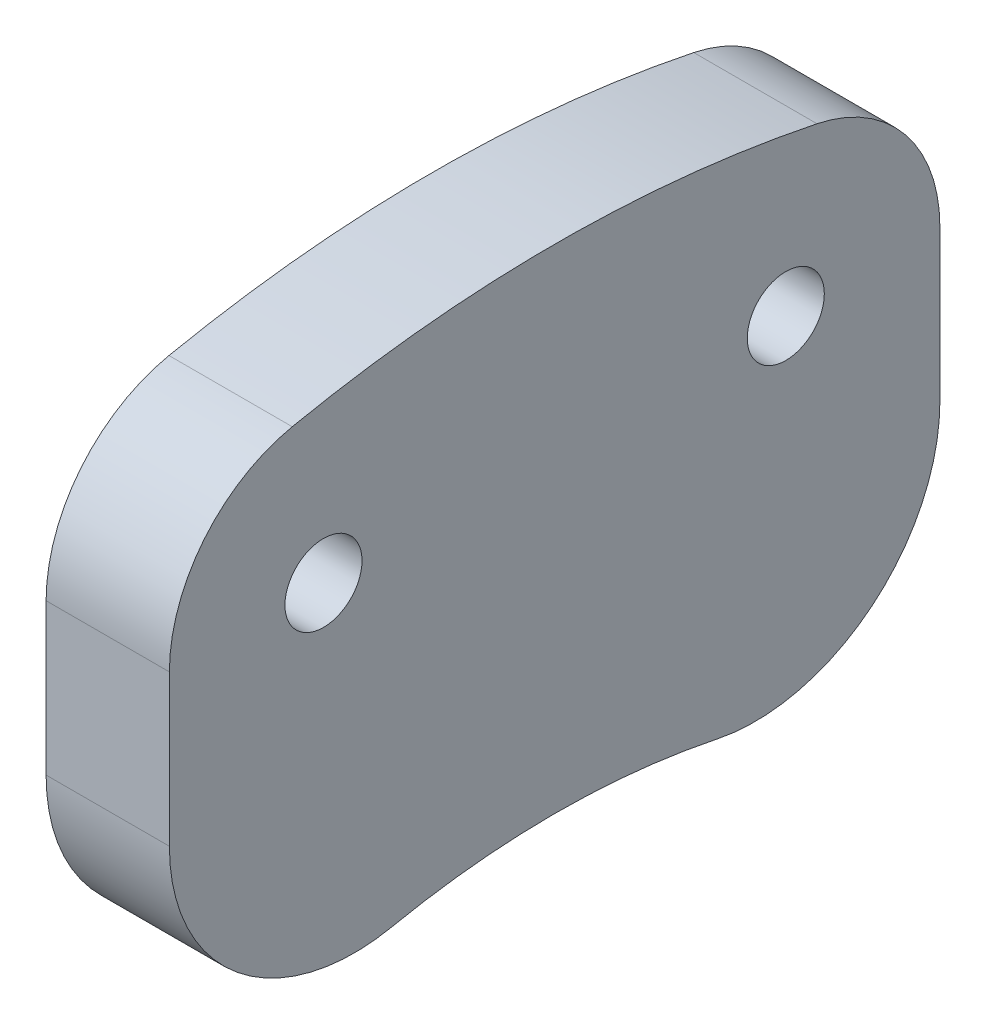
ISO-10303-21;
HEADER;
FILE_DESCRIPTION(('STEP AP214'),'2;1');
FILE_NAME('part.step','',(''),(''),'','','');
FILE_SCHEMA(('AUTOMOTIVE_DESIGN { 1 0 10303 214 1 1 1 1 }'));
ENDSEC;
DATA;
#1=APPLICATION_CONTEXT('core data for automotive mechanical design processes');
#2=APPLICATION_PROTOCOL_DEFINITION('international standard','automotive_design',2000,#1);
#3=PRODUCT_CONTEXT('',#1,'mechanical');
#4=PRODUCT('Part','Part','',(#3));
#5=PRODUCT_RELATED_PRODUCT_CATEGORY('part','',(#4));
#6=PRODUCT_DEFINITION_FORMATION('','',#4);
#7=PRODUCT_DEFINITION_CONTEXT('part definition',#1,'design');
#8=PRODUCT_DEFINITION('design','',#6,#7);
#9=PRODUCT_DEFINITION_SHAPE('','',#8);
#10=(LENGTH_UNIT() NAMED_UNIT(*) SI_UNIT(.MILLI.,.METRE.));
#11=(NAMED_UNIT(*) PLANE_ANGLE_UNIT() SI_UNIT($,.RADIAN.));
#12=(NAMED_UNIT(*) SI_UNIT($,.STERADIAN.) SOLID_ANGLE_UNIT());
#13=UNCERTAINTY_MEASURE_WITH_UNIT(LENGTH_MEASURE(1.E-05),#10,'distance_accuracy_value','');
#14=(GEOMETRIC_REPRESENTATION_CONTEXT(3) GLOBAL_UNCERTAINTY_ASSIGNED_CONTEXT((#13)) GLOBAL_UNIT_ASSIGNED_CONTEXT((#10,
#11,#12)) REPRESENTATION_CONTEXT('',''));
#15=CARTESIAN_POINT('',(0.,0.,0.));
#16=DIRECTION('',(0.,0.,1.));
#17=DIRECTION('',(1.,0.,0.));
#18=AXIS2_PLACEMENT_3D('',#15,#16,#17);
#19=CARTESIAN_POINT('',(4.,0.,-12.5));
#20=DIRECTION('',(0.,0.,-1.));
#21=DIRECTION('',(0.,1.,0.));
#22=AXIS2_PLACEMENT_3D('',#19,#20,#21);
#23=PLANE('',#22);
#24=DIRECTION('',(0.,-1.,0.));
#25=VECTOR('',#24,1.);
#26=CARTESIAN_POINT('',(4.,0.,-12.5));
#27=LINE('',#26,#25);
#28=CARTESIAN_POINT('',(4.,9.80532533004706,-12.5));
#29=VERTEX_POINT('',#28);
#30=CARTESIAN_POINT('',(4.,4.90632336884903,-12.5));
#31=VERTEX_POINT('',#30);
#32=EDGE_CURVE('E113',#29,#31,#27,.T.);
#33=ORIENTED_EDGE('',*,*,#32,.T.);
#34=DIRECTION('',(-1.,0.,0.));
#35=VECTOR('',#34,1.);
#36=CARTESIAN_POINT('',(4.,4.90632336884903,-12.5));
#37=LINE('',#36,#35);
#38=CARTESIAN_POINT('',(0.,4.90632336884903,-12.5));
#39=VERTEX_POINT('',#38);
#40=EDGE_CURVE('E11',#31,#39,#37,.T.);
#41=ORIENTED_EDGE('',*,*,#40,.T.);
#42=DIRECTION('',(0.,-1.,0.));
#43=VECTOR('',#42,1.);
#44=CARTESIAN_POINT('',(0.,0.,-12.5));
#45=LINE('',#44,#43);
#46=CARTESIAN_POINT('',(0.,9.80532533004706,-12.5));
#47=VERTEX_POINT('',#46);
#48=EDGE_CURVE('E116',#47,#39,#45,.T.);
#49=ORIENTED_EDGE('',*,*,#48,.F.);
#50=DIRECTION('',(-1.,0.,0.));
#51=VECTOR('',#50,1.);
#52=CARTESIAN_POINT('',(4.,9.80532533004706,-12.5));
#53=LINE('',#52,#51);
#54=EDGE_CURVE('E111',#29,#47,#53,.T.);
#55=ORIENTED_EDGE('',*,*,#54,.F.);
#56=EDGE_LOOP('',(#33,#41,#49,#55));
#57=FACE_BOUND('',#56,.T.);
#58=ADVANCED_FACE('F43',(#57),#23,.T.);
#59=CARTESIAN_POINT('',(4.,9.80532533004706,-7.5));
#60=DIRECTION('',(-1.,0.,0.));
#61=DIRECTION('',(0.,0.,1.));
#62=AXIS2_PLACEMENT_3D('',#59,#60,#61);
#63=CYLINDRICAL_SURFACE('',#62,5.00000000000001);
#64=CARTESIAN_POINT('',(0.,9.80532533004706,-7.5));
#65=DIRECTION('',(1.,0.,0.));
#66=DIRECTION('',(0.,0.,-1.));
#67=AXIS2_PLACEMENT_3D('',#64,#65,#66);
#68=CIRCLE('',#67,5.00000000000001);
#69=CARTESIAN_POINT('',(0.,14.7015269555855,-8.51351351351352));
#70=VERTEX_POINT('',#69);
#71=EDGE_CURVE('E149',#47,#70,#68,.T.);
#72=ORIENTED_EDGE('',*,*,#71,.T.);
#73=DIRECTION('',(-1.,0.,0.));
#74=VECTOR('',#73,1.);
#75=CARTESIAN_POINT('',(4.,14.7015269555855,-8.51351351351352));
#76=LINE('',#75,#74);
#77=CARTESIAN_POINT('',(4.,14.7015269555855,-8.51351351351352));
#78=VERTEX_POINT('',#77);
#79=EDGE_CURVE('E120',#78,#70,#76,.T.);
#80=ORIENTED_EDGE('',*,*,#79,.F.);
#81=CARTESIAN_POINT('',(4.,9.80532533004706,-7.5));
#82=DIRECTION('',(1.,0.,0.));
#83=DIRECTION('',(0.,0.,-1.));
#84=AXIS2_PLACEMENT_3D('',#81,#82,#83);
#85=CIRCLE('',#84,5.00000000000001);
#86=EDGE_CURVE('E123',#29,#78,#85,.T.);
#87=ORIENTED_EDGE('',*,*,#86,.F.);
#88=ORIENTED_EDGE('',*,*,#54,.T.);
#89=EDGE_LOOP('',(#72,#80,#87,#88));
#90=FACE_BOUND('',#89,.T.);
#91=ADVANCED_FACE('F124',(#90),#63,.T.);
#92=CARTESIAN_POINT('',(4.,-26.4265666989376,0.));
#93=DIRECTION('',(-1.,0.,0.));
#94=DIRECTION('',(0.,0.,1.));
#95=AXIS2_PLACEMENT_3D('',#92,#93,#94);
#96=CYLINDRICAL_SURFACE('',#95,42.);
#97=CARTESIAN_POINT('',(0.,-26.4265666989376,0.));
#98=DIRECTION('',(1.,0.,0.));
#99=DIRECTION('',(0.,0.,-1.));
#100=AXIS2_PLACEMENT_3D('',#97,#98,#99);
#101=CIRCLE('',#100,42.);
#102=CARTESIAN_POINT('',(0.,14.7015269555855,8.51351351351351));
#103=VERTEX_POINT('',#102);
#104=EDGE_CURVE('E151',#70,#103,#101,.T.);
#105=ORIENTED_EDGE('',*,*,#104,.T.);
#106=DIRECTION('',(-1.,0.,0.));
#107=VECTOR('',#106,1.);
#108=CARTESIAN_POINT('',(4.,14.7015269555855,8.51351351351351));
#109=LINE('',#108,#107);
#110=CARTESIAN_POINT('',(4.,14.7015269555855,8.51351351351351));
#111=VERTEX_POINT('',#110);
#112=EDGE_CURVE('E158',#111,#103,#109,.T.);
#113=ORIENTED_EDGE('',*,*,#112,.F.);
#114=CARTESIAN_POINT('',(4.,-26.4265666989376,0.));
#115=DIRECTION('',(1.,0.,0.));
#116=DIRECTION('',(0.,0.,-1.));
#117=AXIS2_PLACEMENT_3D('',#114,#115,#116);
#118=CIRCLE('',#117,42.);
#119=EDGE_CURVE('E127',#78,#111,#118,.T.);
#120=ORIENTED_EDGE('',*,*,#119,.F.);
#121=ORIENTED_EDGE('',*,*,#79,.T.);
#122=EDGE_LOOP('',(#105,#113,#120,#121));
#123=FACE_BOUND('',#122,.T.);
#124=ADVANCED_FACE('F191',(#123),#96,.T.);
#125=CARTESIAN_POINT('',(4.,9.80532533004706,7.5));
#126=DIRECTION('',(-1.,0.,0.));
#127=DIRECTION('',(0.,0.,1.));
#128=AXIS2_PLACEMENT_3D('',#125,#126,#127);
#129=CYLINDRICAL_SURFACE('',#128,5.00000000000001);
#130=CARTESIAN_POINT('',(0.,9.80532533004706,7.5));
#131=DIRECTION('',(1.,0.,0.));
#132=DIRECTION('',(0.,0.,-1.));
#133=AXIS2_PLACEMENT_3D('',#130,#131,#132);
#134=CIRCLE('',#133,5.00000000000001);
#135=CARTESIAN_POINT('',(0.,9.80532533004706,12.5));
#136=VERTEX_POINT('',#135);
#137=EDGE_CURVE('E153',#103,#136,#134,.T.);
#138=ORIENTED_EDGE('',*,*,#137,.T.);
#139=DIRECTION('',(-1.,0.,0.));
#140=VECTOR('',#139,1.);
#141=CARTESIAN_POINT('',(4.,9.80532533004706,12.5));
#142=LINE('',#141,#140);
#143=CARTESIAN_POINT('',(4.,9.80532533004706,12.5));
#144=VERTEX_POINT('',#143);
#145=EDGE_CURVE('E147',#144,#136,#142,.T.);
#146=ORIENTED_EDGE('',*,*,#145,.F.);
#147=CARTESIAN_POINT('',(4.,9.80532533004706,7.5));
#148=DIRECTION('',(1.,0.,0.));
#149=DIRECTION('',(0.,0.,-1.));
#150=AXIS2_PLACEMENT_3D('',#147,#148,#149);
#151=CIRCLE('',#150,5.00000000000001);
#152=EDGE_CURVE('E140',#111,#144,#151,.T.);
#153=ORIENTED_EDGE('',*,*,#152,.F.);
#154=ORIENTED_EDGE('',*,*,#112,.T.);
#155=EDGE_LOOP('',(#138,#146,#153,#154));
#156=FACE_BOUND('',#155,.T.);
#157=ADVANCED_FACE('F187',(#156),#129,.T.);
#158=CARTESIAN_POINT('',(4.,0.,12.5));
#159=DIRECTION('',(0.,0.,-1.));
#160=DIRECTION('',(0.,1.,0.));
#161=AXIS2_PLACEMENT_3D('',#158,#159,#160);
#162=PLANE('',#161);
#163=DIRECTION('',(0.,-1.,0.));
#164=VECTOR('',#163,1.);
#165=CARTESIAN_POINT('',(0.,0.,12.5));
#166=LINE('',#165,#164);
#167=CARTESIAN_POINT('',(0.,4.90632336884903,12.5));
#168=VERTEX_POINT('',#167);
#169=EDGE_CURVE('E133',#136,#168,#166,.T.);
#170=ORIENTED_EDGE('',*,*,#169,.T.);
#171=DIRECTION('',(1.,0.,0.));
#172=VECTOR('',#171,1.);
#173=CARTESIAN_POINT('',(4.,4.90632336884903,12.5));
#174=LINE('',#173,#172);
#175=CARTESIAN_POINT('',(4.,4.90632336884903,12.5));
#176=VERTEX_POINT('',#175);
#177=EDGE_CURVE('E66',#168,#176,#174,.T.);
#178=ORIENTED_EDGE('',*,*,#177,.T.);
#179=DIRECTION('',(0.,-1.,0.));
#180=VECTOR('',#179,1.);
#181=CARTESIAN_POINT('',(4.,0.,12.5));
#182=LINE('',#181,#180);
#183=EDGE_CURVE('E142',#144,#176,#182,.T.);
#184=ORIENTED_EDGE('',*,*,#183,.F.);
#185=ORIENTED_EDGE('',*,*,#145,.T.);
#186=EDGE_LOOP('',(#170,#178,#184,#185));
#187=FACE_BOUND('',#186,.T.);
#188=ADVANCED_FACE('F183',(#187),#162,.F.);
#189=CARTESIAN_POINT('',(4.,-26.4265666989376,0.));
#190=DIRECTION('',(-1.,0.,0.));
#191=DIRECTION('',(0.,0.,1.));
#192=AXIS2_PLACEMENT_3D('',#189,#190,#191);
#193=CYLINDRICAL_SURFACE('',#192,26.);
#194=CARTESIAN_POINT('',(4.,-26.4265666989376,0.));
#195=DIRECTION('',(1.,0.,0.));
#196=DIRECTION('',(0.,0.,-1.));
#197=AXIS2_PLACEMENT_3D('',#194,#195,#196);
#198=CIRCLE('',#197,26.);
#199=CARTESIAN_POINT('',(4.,-0.968593518860958,-5.28125000000001));
#200=VERTEX_POINT('',#199);
#201=CARTESIAN_POINT('',(4.,-0.968593518860958,5.28125));
#202=VERTEX_POINT('',#201);
#203=EDGE_CURVE('E144',#200,#202,#198,.T.);
#204=ORIENTED_EDGE('',*,*,#203,.T.);
#205=DIRECTION('',(-1.,0.,0.));
#206=VECTOR('',#205,1.);
#207=CARTESIAN_POINT('',(4.,-0.968593518860958,5.28125));
#208=LINE('',#207,#206);
#209=CARTESIAN_POINT('',(0.,-0.968593518860958,5.28125));
#210=VERTEX_POINT('',#209);
#211=EDGE_CURVE('E163',#202,#210,#208,.T.);
#212=ORIENTED_EDGE('',*,*,#211,.T.);
#213=CARTESIAN_POINT('',(0.,-26.4265666989376,0.));
#214=DIRECTION('',(1.,0.,0.));
#215=DIRECTION('',(0.,0.,-1.));
#216=AXIS2_PLACEMENT_3D('',#213,#214,#215);
#217=CIRCLE('',#216,26.);
#218=CARTESIAN_POINT('',(0.,-0.968593518860958,-5.28125000000001));
#219=VERTEX_POINT('',#218);
#220=EDGE_CURVE('E130',#219,#210,#217,.T.);
#221=ORIENTED_EDGE('',*,*,#220,.F.);
#222=DIRECTION('',(-1.,0.,0.));
#223=VECTOR('',#222,1.);
#224=CARTESIAN_POINT('',(4.,-0.968593518860958,-5.28125000000001));
#225=LINE('',#224,#223);
#226=EDGE_CURVE('E119',#219,#200,#225,.F.);
#227=ORIENTED_EDGE('',*,*,#226,.T.);
#228=EDGE_LOOP('',(#204,#212,#221,#227));
#229=FACE_BOUND('',#228,.T.);
#230=ADVANCED_FACE('F175',(#229),#193,.F.);
#231=CARTESIAN_POINT('',(4.,0.,0.));
#232=DIRECTION('',(1.,0.,0.));
#233=DIRECTION('',(0.,0.,-1.));
#234=AXIS2_PLACEMENT_3D('',#231,#232,#233);
#235=PLANE('',#234);
#236=CARTESIAN_POINT('',(4.,9.80532533004706,-7.5));
#237=DIRECTION('',(1.,0.,0.));
#238=DIRECTION('',(0.,0.,-1.));
#239=AXIS2_PLACEMENT_3D('',#236,#237,#238);
#240=CIRCLE('',#239,1.24999999999999);
#241=CARTESIAN_POINT('',(4.,9.80532533004706,-8.74999999999999));
#242=VERTEX_POINT('',#241);
#243=EDGE_CURVE('E336',#242,#242,#240,.T.);
#244=ORIENTED_EDGE('',*,*,#243,.F.);
#245=EDGE_LOOP('',(#244));
#246=FACE_BOUND('',#245,.T.);
#247=CARTESIAN_POINT('',(4.,9.80532533004706,7.5));
#248=DIRECTION('',(1.,0.,0.));
#249=DIRECTION('',(0.,0.,-1.));
#250=AXIS2_PLACEMENT_3D('',#247,#248,#249);
#251=CIRCLE('',#250,1.24999999999999);
#252=CARTESIAN_POINT('',(4.,9.80532533004706,6.25000000000001));
#253=VERTEX_POINT('',#252);
#254=EDGE_CURVE('E136',#253,#253,#251,.T.);
#255=ORIENTED_EDGE('',*,*,#254,.F.);
#256=EDGE_LOOP('',(#255));
#257=FACE_BOUND('',#256,.T.);
#258=ORIENTED_EDGE('',*,*,#183,.T.);
#259=CARTESIAN_POINT('',(4.,4.90632336884902,6.50000000000001));
#260=DIRECTION('',(1.,0.,0.));
#261=DIRECTION('',(0.,0.,-1.));
#262=AXIS2_PLACEMENT_3D('',#259,#260,#261);
#263=CIRCLE('',#262,6.);
#264=EDGE_CURVE('E51',#176,#202,#263,.T.);
#265=ORIENTED_EDGE('',*,*,#264,.T.);
#266=ORIENTED_EDGE('',*,*,#203,.F.);
#267=CARTESIAN_POINT('',(4.,4.90632336884903,-6.50000000000001));
#268=DIRECTION('',(1.,0.,0.));
#269=DIRECTION('',(0.,0.,-1.));
#270=AXIS2_PLACEMENT_3D('',#267,#268,#269);
#271=CIRCLE('',#270,6.);
#272=EDGE_CURVE('E58',#200,#31,#271,.T.);
#273=ORIENTED_EDGE('',*,*,#272,.T.);
#274=ORIENTED_EDGE('',*,*,#32,.F.);
#275=ORIENTED_EDGE('',*,*,#86,.T.);
#276=ORIENTED_EDGE('',*,*,#119,.T.);
#277=ORIENTED_EDGE('',*,*,#152,.T.);
#278=EDGE_LOOP('',(#258,#265,#266,#273,#274,#275,#276,#277));
#279=FACE_BOUND('',#278,.T.);
#280=ADVANCED_FACE('F129',(#246,#257,#279),#235,.T.);
#281=CARTESIAN_POINT('',(0.,0.,0.));
#282=DIRECTION('',(1.,0.,0.));
#283=DIRECTION('',(0.,0.,-1.));
#284=AXIS2_PLACEMENT_3D('',#281,#282,#283);
#285=PLANE('',#284);
#286=CARTESIAN_POINT('',(0.,9.80532533004706,-7.5));
#287=DIRECTION('',(-1.,0.,0.));
#288=DIRECTION('',(0.,0.,1.));
#289=AXIS2_PLACEMENT_3D('',#286,#287,#288);
#290=CIRCLE('',#289,1.24999999999999);
#291=CARTESIAN_POINT('',(0.,9.80532533004706,-6.25000000000001));
#292=VERTEX_POINT('',#291);
#293=EDGE_CURVE('E333',#292,#292,#290,.T.);
#294=ORIENTED_EDGE('',*,*,#293,.F.);
#295=EDGE_LOOP('',(#294));
#296=FACE_BOUND('',#295,.T.);
#297=CARTESIAN_POINT('',(0.,9.80532533004706,7.5));
#298=DIRECTION('',(-1.,0.,0.));
#299=DIRECTION('',(0.,0.,1.));
#300=AXIS2_PLACEMENT_3D('',#297,#298,#299);
#301=CIRCLE('',#300,1.24999999999999);
#302=CARTESIAN_POINT('',(0.,9.80532533004706,8.74999999999999));
#303=VERTEX_POINT('',#302);
#304=EDGE_CURVE('E337',#303,#303,#301,.T.);
#305=ORIENTED_EDGE('',*,*,#304,.F.);
#306=EDGE_LOOP('',(#305));
#307=FACE_BOUND('',#306,.T.);
#308=ORIENTED_EDGE('',*,*,#220,.T.);
#309=CARTESIAN_POINT('',(0.,4.90632336884902,6.50000000000001));
#310=DIRECTION('',(1.,0.,0.));
#311=DIRECTION('',(0.,0.,-1.));
#312=AXIS2_PLACEMENT_3D('',#309,#310,#311);
#313=CIRCLE('',#312,6.);
#314=EDGE_CURVE('E168',#210,#168,#313,.F.);
#315=ORIENTED_EDGE('',*,*,#314,.T.);
#316=ORIENTED_EDGE('',*,*,#169,.F.);
#317=ORIENTED_EDGE('',*,*,#137,.F.);
#318=ORIENTED_EDGE('',*,*,#104,.F.);
#319=ORIENTED_EDGE('',*,*,#71,.F.);
#320=ORIENTED_EDGE('',*,*,#48,.T.);
#321=CARTESIAN_POINT('',(0.,4.90632336884903,-6.50000000000001));
#322=DIRECTION('',(1.,0.,0.));
#323=DIRECTION('',(0.,0.,-1.));
#324=AXIS2_PLACEMENT_3D('',#321,#322,#323);
#325=CIRCLE('',#324,6.);
#326=EDGE_CURVE('E166',#39,#219,#325,.F.);
#327=ORIENTED_EDGE('',*,*,#326,.T.);
#328=EDGE_LOOP('',(#308,#315,#316,#317,#318,#319,#320,#327));
#329=FACE_BOUND('',#328,.T.);
#330=ADVANCED_FACE('F181',(#296,#307,#329),#285,.F.);
#331=CARTESIAN_POINT('',(4.,4.90632336884902,6.50000000000001));
#332=DIRECTION('',(-1.,0.,0.));
#333=DIRECTION('',(0.,0.,1.));
#334=AXIS2_PLACEMENT_3D('',#331,#332,#333);
#335=CYLINDRICAL_SURFACE('',#334,6.);
#336=ORIENTED_EDGE('',*,*,#264,.F.);
#337=ORIENTED_EDGE('',*,*,#177,.F.);
#338=ORIENTED_EDGE('',*,*,#314,.F.);
#339=ORIENTED_EDGE('',*,*,#211,.F.);
#340=EDGE_LOOP('',(#336,#337,#338,#339));
#341=FACE_BOUND('',#340,.T.);
#342=ADVANCED_FACE('F178',(#341),#335,.T.);
#343=CARTESIAN_POINT('',(4.,4.90632336884903,-6.50000000000001));
#344=DIRECTION('',(-1.,0.,0.));
#345=DIRECTION('',(0.,0.,1.));
#346=AXIS2_PLACEMENT_3D('',#343,#344,#345);
#347=CYLINDRICAL_SURFACE('',#346,6.);
#348=ORIENTED_EDGE('',*,*,#272,.F.);
#349=ORIENTED_EDGE('',*,*,#226,.F.);
#350=ORIENTED_EDGE('',*,*,#326,.F.);
#351=ORIENTED_EDGE('',*,*,#40,.F.);
#352=EDGE_LOOP('',(#348,#349,#350,#351));
#353=FACE_BOUND('',#352,.T.);
#354=ADVANCED_FACE('F45',(#353),#347,.T.);
#355=CARTESIAN_POINT('',(0.,9.80532533004706,7.5));
#356=DIRECTION('',(-1.,0.,0.));
#357=DIRECTION('',(0.,0.,1.));
#358=AXIS2_PLACEMENT_3D('',#355,#356,#357);
#359=CYLINDRICAL_SURFACE('',#358,1.24999999999999);
#360=ORIENTED_EDGE('',*,*,#304,.T.);
#361=EDGE_LOOP('',(#360));
#362=FACE_BOUND('',#361,.T.);
#363=ORIENTED_EDGE('',*,*,#254,.T.);
#364=EDGE_LOOP('',(#363));
#365=FACE_BOUND('',#364,.T.);
#366=ADVANCED_FACE('F209',(#362,#365),#359,.F.);
#367=CARTESIAN_POINT('',(0.,9.80532533004706,-7.5));
#368=DIRECTION('',(-1.,0.,0.));
#369=DIRECTION('',(0.,0.,1.));
#370=AXIS2_PLACEMENT_3D('',#367,#368,#369);
#371=CYLINDRICAL_SURFACE('',#370,1.24999999999999);
#372=ORIENTED_EDGE('',*,*,#293,.T.);
#373=EDGE_LOOP('',(#372));
#374=FACE_BOUND('',#373,.T.);
#375=ORIENTED_EDGE('',*,*,#243,.T.);
#376=EDGE_LOOP('',(#375));
#377=FACE_BOUND('',#376,.T.);
#378=ADVANCED_FACE('F262',(#374,#377),#371,.F.);
#379=CLOSED_SHELL('',(#58,#91,#124,#157,#188,#230,#280,#330,#342,#354,#366,#378));
#380=MANIFOLD_SOLID_BREP('B2',#379);
#381=ADVANCED_BREP_SHAPE_REPRESENTATION('',(#18,#380),#14);
#382=SHAPE_DEFINITION_REPRESENTATION(#9,#381);
ENDSEC;
END-ISO-10303-21;
